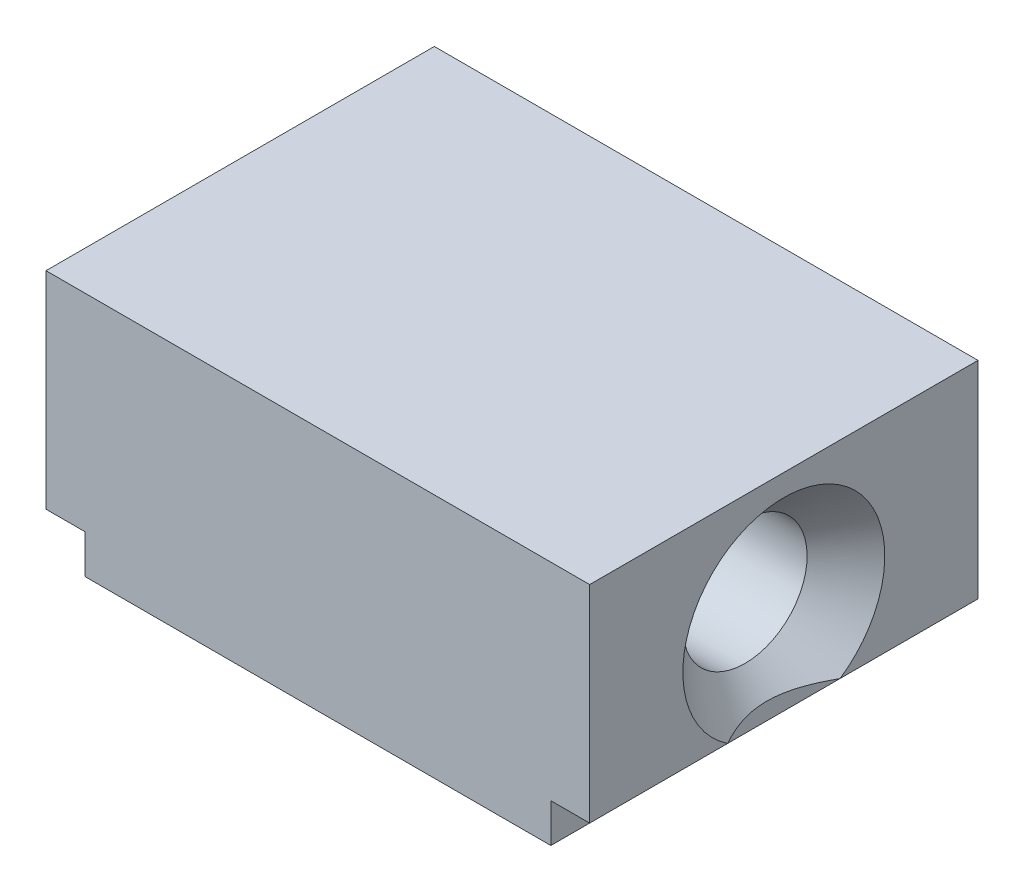
ISO-10303-21;
HEADER;
FILE_DESCRIPTION(('STEP AP214'),'2;1');
FILE_NAME('part.step','',(''),(''),'','','');
FILE_SCHEMA(('AUTOMOTIVE_DESIGN { 1 0 10303 214 1 1 1 1 }'));
ENDSEC;
DATA;
#1=APPLICATION_CONTEXT('core data for automotive mechanical design processes');
#2=APPLICATION_PROTOCOL_DEFINITION('international standard','automotive_design',2000,#1);
#3=PRODUCT_CONTEXT('',#1,'mechanical');
#4=PRODUCT('Part','Part','',(#3));
#5=PRODUCT_RELATED_PRODUCT_CATEGORY('part','',(#4));
#6=PRODUCT_DEFINITION_FORMATION('','',#4);
#7=PRODUCT_DEFINITION_CONTEXT('part definition',#1,'design');
#8=PRODUCT_DEFINITION('design','',#6,#7);
#9=PRODUCT_DEFINITION_SHAPE('','',#8);
#10=(LENGTH_UNIT() NAMED_UNIT(*) SI_UNIT(.MILLI.,.METRE.));
#11=(NAMED_UNIT(*) PLANE_ANGLE_UNIT() SI_UNIT($,.RADIAN.));
#12=(NAMED_UNIT(*) SI_UNIT($,.STERADIAN.) SOLID_ANGLE_UNIT());
#13=UNCERTAINTY_MEASURE_WITH_UNIT(LENGTH_MEASURE(1.E-05),#10,'distance_accuracy_value','');
#14=(GEOMETRIC_REPRESENTATION_CONTEXT(3) GLOBAL_UNCERTAINTY_ASSIGNED_CONTEXT((#13)) GLOBAL_UNIT_ASSIGNED_CONTEXT((#10,
#11,#12)) REPRESENTATION_CONTEXT('',''));
#15=CARTESIAN_POINT('',(0.,0.,0.));
#16=DIRECTION('',(0.,0.,1.));
#17=DIRECTION('',(1.,0.,0.));
#18=AXIS2_PLACEMENT_3D('',#15,#16,#17);
#19=CARTESIAN_POINT('',(3.,0.5,-2.5));
#20=DIRECTION('',(-1.,0.,0.));
#21=DIRECTION('',(0.,0.,1.));
#22=AXIS2_PLACEMENT_3D('',#19,#20,#21);
#23=PLANE('',#22);
#24=DIRECTION('',(0.,0.,-1.));
#25=VECTOR('',#24,1.);
#26=CARTESIAN_POINT('',(3.,0.,-2.5));
#27=LINE('',#26,#25);
#28=CARTESIAN_POINT('',(3.,0.,2.5));
#29=VERTEX_POINT('',#28);
#30=CARTESIAN_POINT('',(3.,0.,-2.5));
#31=VERTEX_POINT('',#30);
#32=EDGE_CURVE('E153',#29,#31,#27,.T.);
#33=ORIENTED_EDGE('',*,*,#32,.T.);
#34=DIRECTION('',(0.,-1.,0.));
#35=VECTOR('',#34,1.);
#36=CARTESIAN_POINT('',(3.,0.5,-2.5));
#37=LINE('',#36,#35);
#38=CARTESIAN_POINT('',(3.,0.5,-2.5));
#39=VERTEX_POINT('',#38);
#40=EDGE_CURVE('E207',#39,#31,#37,.T.);
#41=ORIENTED_EDGE('',*,*,#40,.F.);
#42=DIRECTION('',(0.,0.,-1.));
#43=VECTOR('',#42,1.);
#44=CARTESIAN_POINT('',(3.,0.5,-2.5));
#45=LINE('',#44,#43);
#46=CARTESIAN_POINT('',(3.,0.5,2.5));
#47=VERTEX_POINT('',#46);
#48=EDGE_CURVE('E179',#47,#39,#45,.T.);
#49=ORIENTED_EDGE('',*,*,#48,.F.);
#50=DIRECTION('',(0.,-1.,0.));
#51=VECTOR('',#50,1.);
#52=CARTESIAN_POINT('',(3.,0.5,2.5));
#53=LINE('',#52,#51);
#54=EDGE_CURVE('E187',#47,#29,#53,.T.);
#55=ORIENTED_EDGE('',*,*,#54,.T.);
#56=EDGE_LOOP('',(#33,#41,#49,#55));
#57=FACE_BOUND('',#56,.T.);
#58=ADVANCED_FACE('F41',(#57),#23,.F.);
#59=CARTESIAN_POINT('',(-3.,0.5,-2.5));
#60=DIRECTION('',(0.,0.,1.));
#61=DIRECTION('',(1.,0.,0.));
#62=AXIS2_PLACEMENT_3D('',#59,#60,#61);
#63=PLANE('',#62);
#64=DIRECTION('',(-1.,0.,0.));
#65=VECTOR('',#64,1.);
#66=CARTESIAN_POINT('',(-3.,0.,-2.5));
#67=LINE('',#66,#65);
#68=CARTESIAN_POINT('',(-3.,0.,-2.5));
#69=VERTEX_POINT('',#68);
#70=EDGE_CURVE('E158',#31,#69,#67,.T.);
#71=ORIENTED_EDGE('',*,*,#70,.T.);
#72=DIRECTION('',(0.,-1.,0.));
#73=VECTOR('',#72,1.);
#74=CARTESIAN_POINT('',(-3.,0.5,-2.5));
#75=LINE('',#74,#73);
#76=CARTESIAN_POINT('',(-3.,0.5,-2.5));
#77=VERTEX_POINT('',#76);
#78=EDGE_CURVE('E203',#77,#69,#75,.T.);
#79=ORIENTED_EDGE('',*,*,#78,.F.);
#80=DIRECTION('',(-1.,0.,0.));
#81=VECTOR('',#80,1.);
#82=CARTESIAN_POINT('',(-3.5,0.5,-2.5));
#83=LINE('',#82,#81);
#84=CARTESIAN_POINT('',(-3.5,0.5,-2.5));
#85=VERTEX_POINT('',#84);
#86=EDGE_CURVE('E171',#77,#85,#83,.T.);
#87=ORIENTED_EDGE('',*,*,#86,.T.);
#88=DIRECTION('',(0.,-1.,0.));
#89=VECTOR('',#88,1.);
#90=CARTESIAN_POINT('',(-3.5,14.9223252670426,-2.5));
#91=LINE('',#90,#89);
#92=CARTESIAN_POINT('',(-3.5,3.16,-2.5));
#93=VERTEX_POINT('',#92);
#94=EDGE_CURVE('E172',#93,#85,#91,.T.);
#95=ORIENTED_EDGE('',*,*,#94,.F.);
#96=DIRECTION('',(-1.,0.,0.));
#97=VECTOR('',#96,1.);
#98=CARTESIAN_POINT('',(-3.5,3.16,-2.5));
#99=LINE('',#98,#97);
#100=CARTESIAN_POINT('',(3.5,3.16,-2.5));
#101=VERTEX_POINT('',#100);
#102=EDGE_CURVE('E151',#101,#93,#99,.T.);
#103=ORIENTED_EDGE('',*,*,#102,.F.);
#104=DIRECTION('',(0.,-1.,0.));
#105=VECTOR('',#104,1.);
#106=CARTESIAN_POINT('',(3.5,14.9223252670426,-2.5));
#107=LINE('',#106,#105);
#108=CARTESIAN_POINT('',(3.5,0.5,-2.5));
#109=VERTEX_POINT('',#108);
#110=EDGE_CURVE('E167',#101,#109,#107,.T.);
#111=ORIENTED_EDGE('',*,*,#110,.T.);
#112=EDGE_CURVE('E174',#109,#39,#83,.T.);
#113=ORIENTED_EDGE('',*,*,#112,.T.);
#114=ORIENTED_EDGE('',*,*,#40,.T.);
#115=EDGE_LOOP('',(#71,#79,#87,#95,#103,#111,#113,#114));
#116=FACE_BOUND('',#115,.T.);
#117=ADVANCED_FACE('F236',(#116),#63,.F.);
#118=CARTESIAN_POINT('',(-3.,0.5,-2.5));
#119=DIRECTION('',(1.,0.,0.));
#120=DIRECTION('',(0.,0.,-1.));
#121=AXIS2_PLACEMENT_3D('',#118,#119,#120);
#122=PLANE('',#121);
#123=DIRECTION('',(0.,0.,1.));
#124=VECTOR('',#123,1.);
#125=CARTESIAN_POINT('',(-3.,0.,-2.5));
#126=LINE('',#125,#124);
#127=CARTESIAN_POINT('',(-3.,0.,2.5));
#128=VERTEX_POINT('',#127);
#129=EDGE_CURVE('E191',#69,#128,#126,.T.);
#130=ORIENTED_EDGE('',*,*,#129,.T.);
#131=DIRECTION('',(0.,-1.,0.));
#132=VECTOR('',#131,1.);
#133=CARTESIAN_POINT('',(-3.,0.5,2.5));
#134=LINE('',#133,#132);
#135=CARTESIAN_POINT('',(-3.,0.5,2.5));
#136=VERTEX_POINT('',#135);
#137=EDGE_CURVE('E199',#136,#128,#134,.T.);
#138=ORIENTED_EDGE('',*,*,#137,.F.);
#139=DIRECTION('',(0.,0.,1.));
#140=VECTOR('',#139,1.);
#141=CARTESIAN_POINT('',(-3.,0.5,-2.5));
#142=LINE('',#141,#140);
#143=EDGE_CURVE('E183',#77,#136,#142,.T.);
#144=ORIENTED_EDGE('',*,*,#143,.F.);
#145=ORIENTED_EDGE('',*,*,#78,.T.);
#146=EDGE_LOOP('',(#130,#138,#144,#145));
#147=FACE_BOUND('',#146,.T.);
#148=ADVANCED_FACE('F240',(#147),#122,.F.);
#149=CARTESIAN_POINT('',(-3.,0.5,2.5));
#150=DIRECTION('',(0.,0.,-1.));
#151=DIRECTION('',(-1.,0.,0.));
#152=AXIS2_PLACEMENT_3D('',#149,#150,#151);
#153=PLANE('',#152);
#154=DIRECTION('',(1.,0.,0.));
#155=VECTOR('',#154,1.);
#156=CARTESIAN_POINT('',(-3.,0.,2.5));
#157=LINE('',#156,#155);
#158=EDGE_CURVE('E184',#128,#29,#157,.T.);
#159=ORIENTED_EDGE('',*,*,#158,.T.);
#160=ORIENTED_EDGE('',*,*,#54,.F.);
#161=DIRECTION('',(1.,0.,0.));
#162=VECTOR('',#161,1.);
#163=CARTESIAN_POINT('',(-3.5,0.5,2.5));
#164=LINE('',#163,#162);
#165=CARTESIAN_POINT('',(3.5,0.5,2.5));
#166=VERTEX_POINT('',#165);
#167=EDGE_CURVE('E134',#47,#166,#164,.T.);
#168=ORIENTED_EDGE('',*,*,#167,.T.);
#169=DIRECTION('',(0.,-1.,0.));
#170=VECTOR('',#169,1.);
#171=CARTESIAN_POINT('',(3.5,14.9223252670426,2.5));
#172=LINE('',#171,#170);
#173=CARTESIAN_POINT('',(3.5,3.16,2.5));
#174=VERTEX_POINT('',#173);
#175=EDGE_CURVE('E141',#174,#166,#172,.T.);
#176=ORIENTED_EDGE('',*,*,#175,.F.);
#177=DIRECTION('',(1.,0.,0.));
#178=VECTOR('',#177,1.);
#179=CARTESIAN_POINT('',(-3.5,3.16,2.5));
#180=LINE('',#179,#178);
#181=CARTESIAN_POINT('',(-3.5,3.16,2.5));
#182=VERTEX_POINT('',#181);
#183=EDGE_CURVE('E138',#182,#174,#180,.T.);
#184=ORIENTED_EDGE('',*,*,#183,.F.);
#185=DIRECTION('',(0.,-1.,0.));
#186=VECTOR('',#185,1.);
#187=CARTESIAN_POINT('',(-3.5,14.9223252670426,2.5));
#188=LINE('',#187,#186);
#189=CARTESIAN_POINT('',(-3.5,0.5,2.5));
#190=VERTEX_POINT('',#189);
#191=EDGE_CURVE('E122',#182,#190,#188,.T.);
#192=ORIENTED_EDGE('',*,*,#191,.T.);
#193=EDGE_CURVE('E147',#190,#136,#164,.T.);
#194=ORIENTED_EDGE('',*,*,#193,.T.);
#195=ORIENTED_EDGE('',*,*,#137,.T.);
#196=EDGE_LOOP('',(#159,#160,#168,#176,#184,#192,#194,#195));
#197=FACE_BOUND('',#196,.T.);
#198=ADVANCED_FACE('F139',(#197),#153,.F.);
#199=CARTESIAN_POINT('',(0.,0.,0.));
#200=DIRECTION('',(0.,1.,0.));
#201=DIRECTION('',(0.,0.,1.));
#202=AXIS2_PLACEMENT_3D('',#199,#200,#201);
#203=PLANE('',#202);
#204=ORIENTED_EDGE('',*,*,#32,.F.);
#205=ORIENTED_EDGE('',*,*,#158,.F.);
#206=ORIENTED_EDGE('',*,*,#129,.F.);
#207=ORIENTED_EDGE('',*,*,#70,.F.);
#208=EDGE_LOOP('',(#204,#205,#206,#207));
#209=FACE_BOUND('',#208,.T.);
#210=ADVANCED_FACE('F247',(#209),#203,.F.);
#211=CARTESIAN_POINT('',(0.,0.5,0.));
#212=DIRECTION('',(0.,-1.,0.));
#213=DIRECTION('',(0.,0.,-1.));
#214=AXIS2_PLACEMENT_3D('',#211,#212,#213);
#215=PLANE('',#214);
#216=DIRECTION('',(0.,0.,-1.));
#217=VECTOR('',#216,1.);
#218=CARTESIAN_POINT('',(3.5,0.5,2.5));
#219=LINE('',#218,#217);
#220=CARTESIAN_POINT('',(3.5,0.5,-0.72360210060502));
#221=VERTEX_POINT('',#220);
#222=EDGE_CURVE('E178',#221,#109,#219,.T.);
#223=ORIENTED_EDGE('',*,*,#222,.F.);
#224=CARTESIAN_POINT('',(3.5,0.5,-0.72360210060502));
#225=CARTESIAN_POINT('',(3.47856687928063,0.5,-0.685039533998078));
#226=CARTESIAN_POINT('',(3.45799700577048,0.5,-0.646006901532778));
#227=CARTESIAN_POINT('',(3.41912062776124,0.5,-0.5666397839983));
#228=CARTESIAN_POINT('',(3.40082369728594,0.5,-0.526300638310944));
#229=CARTESIAN_POINT('',(3.35013879452994,0.5,-0.402591072974547));
#230=CARTESIAN_POINT('',(3.32232563261118,0.5,-0.317148275129606));
#231=CARTESIAN_POINT('',(3.29094418799593,0.5,-0.166107175464401));
#232=CARTESIAN_POINT('',(3.28281885997334,0.5,-0.101492334869597));
#233=CARTESIAN_POINT('',(3.27843948171255,0.5,0.0277503592845039));
#234=CARTESIAN_POINT('',(3.28210862193313,0.5,0.092375399041484));
#235=CARTESIAN_POINT('',(3.30256679090435,0.5,0.235414874133471));
#236=CARTESIAN_POINT('',(3.322314238145,0.5,0.313384284795319));
#237=CARTESIAN_POINT('',(3.37382637152784,0.5,0.465501301179843));
#238=CARTESIAN_POINT('',(3.40566478504021,0.5,0.539622222873336));
#239=CARTESIAN_POINT('',(3.45058211214991,0.5,0.630730789972908));
#240=CARTESIAN_POINT('',(3.46017805233087,0.5,0.649537557182326));
#241=CARTESIAN_POINT('',(3.47978184370034,0.5,0.686799323366569));
#242=CARTESIAN_POINT('',(3.48978704945006,0.5,0.705255712623795));
#243=CARTESIAN_POINT('',(3.49999999999999,0.5,0.723602100605025));
#244=B_SPLINE_CURVE_WITH_KNOTS('',3,(#224,#225,#226,#227,#228,#229,#230,#231,#232,#233,#234,
#235,#236,#237,#238,#239,#240,#241,#242,#243),.UNSPECIFIED.,.F.,.F.,(4,2,2,2,2,2,2,2,2,4),(0.,
0.132308459650684,0.265156578029528,0.533002504889507,0.727397636580817,0.920529372892121,
1.16036979287796,1.40169680746693,1.46503665623533,1.52801719723664),.UNSPECIFIED.);
#245=CARTESIAN_POINT('',(3.5,0.5,0.72360210060502));
#246=VERTEX_POINT('',#245);
#247=EDGE_CURVE('E215',#221,#246,#244,.T.);
#248=ORIENTED_EDGE('',*,*,#247,.T.);
#249=EDGE_CURVE('E162',#166,#246,#219,.T.);
#250=ORIENTED_EDGE('',*,*,#249,.F.);
#251=ORIENTED_EDGE('',*,*,#167,.F.);
#252=ORIENTED_EDGE('',*,*,#48,.T.);
#253=ORIENTED_EDGE('',*,*,#112,.F.);
#254=EDGE_LOOP('',(#223,#248,#250,#251,#252,#253));
#255=FACE_BOUND('',#254,.T.);
#256=ADVANCED_FACE('F250',(#255),#215,.T.);
#257=CARTESIAN_POINT('',(3.5,14.9223252670426,2.5));
#258=DIRECTION('',(-1.,0.,0.));
#259=DIRECTION('',(0.,0.,1.));
#260=AXIS2_PLACEMENT_3D('',#257,#258,#259);
#261=PLANE('',#260);
#262=ORIENTED_EDGE('',*,*,#249,.T.);
#263=CARTESIAN_POINT('',(3.5,1.58,0.));
#264=DIRECTION('',(-1.,0.,0.));
#265=DIRECTION('',(0.,0.,1.));
#266=AXIS2_PLACEMENT_3D('',#263,#264,#265);
#267=CIRCLE('',#266,1.3);
#268=EDGE_CURVE('E211',#246,#221,#267,.T.);
#269=ORIENTED_EDGE('',*,*,#268,.T.);
#270=ORIENTED_EDGE('',*,*,#222,.T.);
#271=ORIENTED_EDGE('',*,*,#110,.F.);
#272=DIRECTION('',(0.,0.,-1.));
#273=VECTOR('',#272,1.);
#274=CARTESIAN_POINT('',(3.5,3.16,2.5));
#275=LINE('',#274,#273);
#276=EDGE_CURVE('E146',#174,#101,#275,.T.);
#277=ORIENTED_EDGE('',*,*,#276,.F.);
#278=ORIENTED_EDGE('',*,*,#175,.T.);
#279=EDGE_LOOP('',(#262,#269,#270,#271,#277,#278));
#280=FACE_BOUND('',#279,.T.);
#281=ADVANCED_FACE('F254',(#280),#261,.F.);
#282=CARTESIAN_POINT('',(-3.5,14.9223252670426,2.5));
#283=DIRECTION('',(1.,0.,0.));
#284=DIRECTION('',(0.,0.,-1.));
#285=AXIS2_PLACEMENT_3D('',#282,#283,#284);
#286=PLANE('',#285);
#287=DIRECTION('',(0.,0.,1.));
#288=VECTOR('',#287,1.);
#289=CARTESIAN_POINT('',(-3.5,0.5,2.5));
#290=LINE('',#289,#288);
#291=CARTESIAN_POINT('',(-3.5,0.5,-0.723602100605025));
#292=VERTEX_POINT('',#291);
#293=EDGE_CURVE('E135',#85,#292,#290,.T.);
#294=ORIENTED_EDGE('',*,*,#293,.T.);
#295=CARTESIAN_POINT('',(-3.5,1.58,0.));
#296=DIRECTION('',(1.,0.,0.));
#297=DIRECTION('',(0.,0.,-1.));
#298=AXIS2_PLACEMENT_3D('',#295,#296,#297);
#299=CIRCLE('',#298,1.3);
#300=CARTESIAN_POINT('',(-3.5,0.5,0.723602100605025));
#301=VERTEX_POINT('',#300);
#302=EDGE_CURVE('E56',#292,#301,#299,.T.);
#303=ORIENTED_EDGE('',*,*,#302,.T.);
#304=EDGE_CURVE('E129',#301,#190,#290,.T.);
#305=ORIENTED_EDGE('',*,*,#304,.T.);
#306=ORIENTED_EDGE('',*,*,#191,.F.);
#307=DIRECTION('',(0.,0.,1.));
#308=VECTOR('',#307,1.);
#309=CARTESIAN_POINT('',(-3.5,3.16,2.5));
#310=LINE('',#309,#308);
#311=EDGE_CURVE('E127',#93,#182,#310,.T.);
#312=ORIENTED_EDGE('',*,*,#311,.F.);
#313=ORIENTED_EDGE('',*,*,#94,.T.);
#314=EDGE_LOOP('',(#294,#303,#305,#306,#312,#313));
#315=FACE_BOUND('',#314,.T.);
#316=ADVANCED_FACE('F124',(#315),#286,.F.);
#317=ORIENTED_EDGE('',*,*,#304,.F.);
#318=CARTESIAN_POINT('',(-3.5,0.5,0.723602100605025));
#319=CARTESIAN_POINT('',(-3.47856687928063,0.5,0.685039533998082));
#320=CARTESIAN_POINT('',(-3.45799700577048,0.5,0.646006901532782));
#321=CARTESIAN_POINT('',(-3.41912062776124,0.5,0.566639783998304));
#322=CARTESIAN_POINT('',(-3.40082369728594,0.5,0.526300638310948));
#323=CARTESIAN_POINT('',(-3.35013879452994,0.5,0.40259107297455));
#324=CARTESIAN_POINT('',(-3.32232563261118,0.5,0.317148275129609));
#325=CARTESIAN_POINT('',(-3.29094418799593,0.5,0.166107175464404));
#326=CARTESIAN_POINT('',(-3.28281885997334,0.5,0.101492334869599));
#327=CARTESIAN_POINT('',(-3.27843948171255,0.5,-0.0277503592845022));
#328=CARTESIAN_POINT('',(-3.28210862193313,0.5,-0.0923753990414826));
#329=CARTESIAN_POINT('',(-3.30256679090434,0.5,-0.23541487413347));
#330=CARTESIAN_POINT('',(-3.322314238145,0.5,-0.313384284795318));
#331=CARTESIAN_POINT('',(-3.37382637152783,0.5,-0.465501301179842));
#332=CARTESIAN_POINT('',(-3.40566478504021,0.5,-0.539622222873336));
#333=CARTESIAN_POINT('',(-3.45058211214991,0.5,-0.630730789972909));
#334=CARTESIAN_POINT('',(-3.46017805233087,0.5,-0.649537557182328));
#335=CARTESIAN_POINT('',(-3.47978184370034,0.5,-0.686799323366572));
#336=CARTESIAN_POINT('',(-3.48978704945006,0.5,-0.705255712623798));
#337=CARTESIAN_POINT('',(-3.49999999999999,0.5,-0.723602100605029));
#338=B_SPLINE_CURVE_WITH_KNOTS('',3,(#318,#319,#320,#321,#322,#323,#324,#325,#326,#327,#328,
#329,#330,#331,#332,#333,#334,#335,#336,#337),.UNSPECIFIED.,.F.,.F.,(4,2,2,2,2,2,2,2,2,4),(0.,
0.132308459650685,0.265156578029529,0.533002504889509,0.72739763658082,0.920529372892125,
1.16036979287796,1.40169680746694,1.46503665623533,1.52801719723665),.UNSPECIFIED.);
#339=EDGE_CURVE('E12',#301,#292,#338,.T.);
#340=ORIENTED_EDGE('',*,*,#339,.T.);
#341=ORIENTED_EDGE('',*,*,#293,.F.);
#342=ORIENTED_EDGE('',*,*,#86,.F.);
#343=ORIENTED_EDGE('',*,*,#143,.T.);
#344=ORIENTED_EDGE('',*,*,#193,.F.);
#345=EDGE_LOOP('',(#317,#340,#341,#342,#343,#344));
#346=FACE_BOUND('',#345,.T.);
#347=ADVANCED_FACE('F224',(#346),#215,.T.);
#348=CARTESIAN_POINT('',(0.,3.16,0.));
#349=DIRECTION('',(0.,1.,0.));
#350=DIRECTION('',(0.,0.,1.));
#351=AXIS2_PLACEMENT_3D('',#348,#349,#350);
#352=PLANE('',#351);
#353=ORIENTED_EDGE('',*,*,#183,.T.);
#354=ORIENTED_EDGE('',*,*,#276,.T.);
#355=ORIENTED_EDGE('',*,*,#102,.T.);
#356=ORIENTED_EDGE('',*,*,#311,.T.);
#357=EDGE_LOOP('',(#353,#354,#355,#356));
#358=FACE_BOUND('',#357,.T.);
#359=ADVANCED_FACE('F150',(#358),#352,.T.);
#360=CARTESIAN_POINT('',(3.5,1.58,0.));
#361=DIRECTION('',(-1.,0.,0.));
#362=DIRECTION('',(0.,0.,1.));
#363=AXIS2_PLACEMENT_3D('',#360,#361,#362);
#364=CYLINDRICAL_SURFACE('',#363,0.8);
#365=CARTESIAN_POINT('',(3.,1.58,0.));
#366=DIRECTION('',(-1.,0.,0.));
#367=DIRECTION('',(0.,0.,1.));
#368=AXIS2_PLACEMENT_3D('',#365,#366,#367);
#369=CIRCLE('',#368,0.8);
#370=CARTESIAN_POINT('',(3.,1.58,0.8));
#371=VERTEX_POINT('',#370);
#372=EDGE_CURVE('E290',#371,#371,#369,.F.);
#373=ORIENTED_EDGE('',*,*,#372,.T.);
#374=EDGE_LOOP('',(#373));
#375=FACE_BOUND('',#374,.T.);
#376=CARTESIAN_POINT('',(-3.,1.58,0.));
#377=DIRECTION('',(1.,0.,0.));
#378=DIRECTION('',(0.,0.,-1.));
#379=AXIS2_PLACEMENT_3D('',#376,#377,#378);
#380=CIRCLE('',#379,0.8);
#381=CARTESIAN_POINT('',(-3.,1.58,-0.8));
#382=VERTEX_POINT('',#381);
#383=EDGE_CURVE('E222',#382,#382,#380,.F.);
#384=ORIENTED_EDGE('',*,*,#383,.T.);
#385=EDGE_LOOP('',(#384));
#386=FACE_BOUND('',#385,.T.);
#387=ADVANCED_FACE('F232',(#375,#386),#364,.F.);
#388=CARTESIAN_POINT('',(3.5,1.58,0.));
#389=DIRECTION('',(1.,0.,0.));
#390=DIRECTION('',(0.,0.,-1.));
#391=AXIS2_PLACEMENT_3D('',#388,#389,#390);
#392=CONICAL_SURFACE('',#391,1.3,0.785398163397448);
#393=ORIENTED_EDGE('',*,*,#372,.F.);
#394=EDGE_LOOP('',(#393));
#395=FACE_BOUND('',#394,.T.);
#396=ORIENTED_EDGE('',*,*,#247,.F.);
#397=ORIENTED_EDGE('',*,*,#268,.F.);
#398=EDGE_LOOP('',(#396,#397));
#399=FACE_BOUND('',#398,.T.);
#400=ADVANCED_FACE('F228',(#395,#399),#392,.F.);
#401=CARTESIAN_POINT('',(-3.,1.58,0.));
#402=DIRECTION('',(-1.,0.,0.));
#403=DIRECTION('',(0.,0.,1.));
#404=AXIS2_PLACEMENT_3D('',#401,#402,#403);
#405=CONICAL_SURFACE('',#404,0.8,0.78539816339745);
#406=ORIENTED_EDGE('',*,*,#339,.F.);
#407=ORIENTED_EDGE('',*,*,#302,.F.);
#408=EDGE_LOOP('',(#406,#407));
#409=FACE_BOUND('',#408,.T.);
#410=ORIENTED_EDGE('',*,*,#383,.F.);
#411=EDGE_LOOP('',(#410));
#412=FACE_BOUND('',#411,.T.);
#413=ADVANCED_FACE('F43',(#409,#412),#405,.F.);
#414=CLOSED_SHELL('',(#58,#117,#148,#198,#210,#256,#281,#316,#347,#359,#387,#400,#413));
#415=MANIFOLD_SOLID_BREP('B2',#414);
#416=ADVANCED_BREP_SHAPE_REPRESENTATION('',(#18,#415),#14);
#417=SHAPE_DEFINITION_REPRESENTATION(#9,#416);
ENDSEC;
END-ISO-10303-21;
